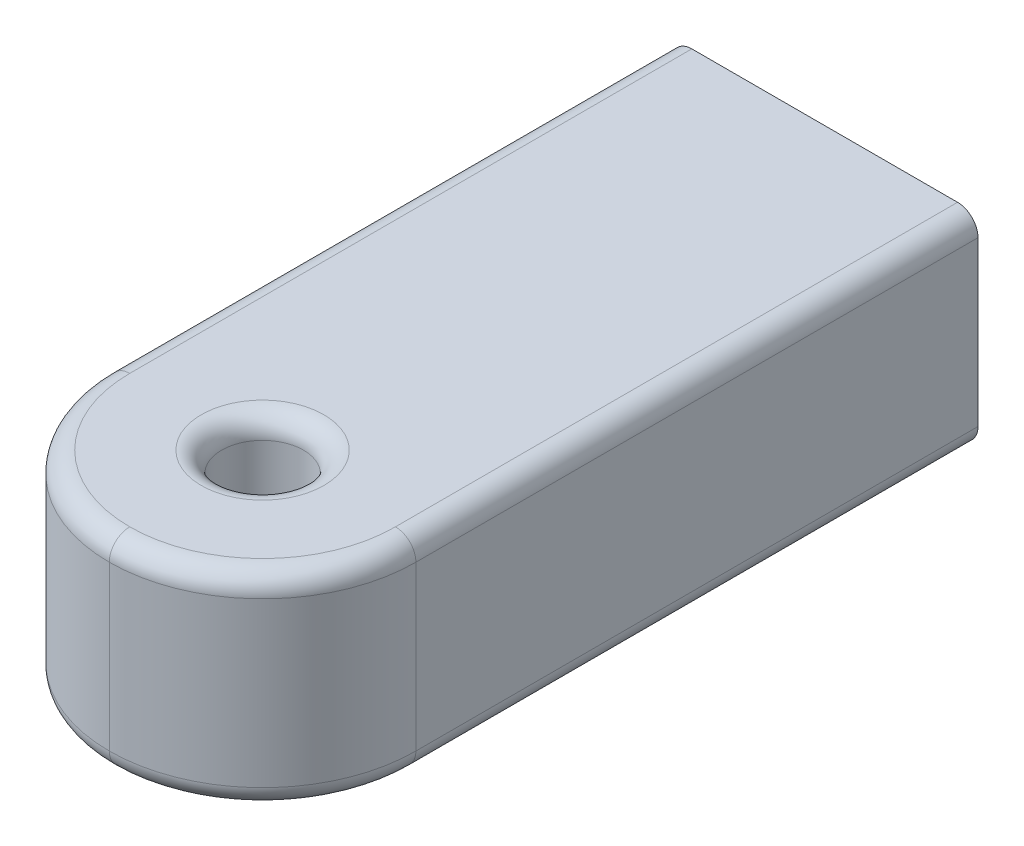
ISO-10303-21;
HEADER;
FILE_DESCRIPTION(('STEP AP214'),'2;1');
FILE_NAME('part.step','',(''),(''),'','','');
FILE_SCHEMA(('AUTOMOTIVE_DESIGN { 1 0 10303 214 1 1 1 1 }'));
ENDSEC;
DATA;
#1=APPLICATION_CONTEXT('core data for automotive mechanical design processes');
#2=APPLICATION_PROTOCOL_DEFINITION('international standard','automotive_design',2000,#1);
#3=PRODUCT_CONTEXT('',#1,'mechanical');
#4=PRODUCT('Part','Part','',(#3));
#5=PRODUCT_RELATED_PRODUCT_CATEGORY('part','',(#4));
#6=PRODUCT_DEFINITION_FORMATION('','',#4);
#7=PRODUCT_DEFINITION_CONTEXT('part definition',#1,'design');
#8=PRODUCT_DEFINITION('design','',#6,#7);
#9=PRODUCT_DEFINITION_SHAPE('','',#8);
#10=(LENGTH_UNIT() NAMED_UNIT(*) SI_UNIT(.MILLI.,.METRE.));
#11=(NAMED_UNIT(*) PLANE_ANGLE_UNIT() SI_UNIT($,.RADIAN.));
#12=(NAMED_UNIT(*) SI_UNIT($,.STERADIAN.) SOLID_ANGLE_UNIT());
#13=UNCERTAINTY_MEASURE_WITH_UNIT(LENGTH_MEASURE(1.E-05),#10,'distance_accuracy_value','');
#14=(GEOMETRIC_REPRESENTATION_CONTEXT(3) GLOBAL_UNCERTAINTY_ASSIGNED_CONTEXT((#13)) GLOBAL_UNIT_ASSIGNED_CONTEXT((#10,
#11,#12)) REPRESENTATION_CONTEXT('',''));
#15=CARTESIAN_POINT('',(0.,0.,0.));
#16=DIRECTION('',(0.,0.,1.));
#17=DIRECTION('',(1.,0.,0.));
#18=AXIS2_PLACEMENT_3D('',#15,#16,#17);
#19=CARTESIAN_POINT('',(7.5,5.,35.));
#20=DIRECTION('',(1.,0.,0.));
#21=DIRECTION('',(0.,1.,0.));
#22=AXIS2_PLACEMENT_3D('',#19,#20,#21);
#23=PLANE('',#22);
#24=DIRECTION('',(0.,-1.,0.));
#25=VECTOR('',#24,1.);
#26=CARTESIAN_POINT('',(7.5,-5.,27.5));
#27=LINE('',#26,#25);
#28=CARTESIAN_POINT('',(7.5,4.,27.5));
#29=VERTEX_POINT('',#28);
#30=CARTESIAN_POINT('',(7.5,-4.,27.5));
#31=VERTEX_POINT('',#30);
#32=EDGE_CURVE('E121',#29,#31,#27,.T.);
#33=ORIENTED_EDGE('',*,*,#32,.T.);
#34=DIRECTION('',(0.,0.,-1.));
#35=VECTOR('',#34,1.);
#36=CARTESIAN_POINT('',(7.5,-4.,35.));
#37=LINE('',#36,#35);
#38=CARTESIAN_POINT('',(7.5,-4.,0.));
#39=VERTEX_POINT('',#38);
#40=EDGE_CURVE('E129',#31,#39,#37,.T.);
#41=ORIENTED_EDGE('',*,*,#40,.T.);
#42=DIRECTION('',(0.,-1.,0.));
#43=VECTOR('',#42,1.);
#44=CARTESIAN_POINT('',(7.5,5.,0.));
#45=LINE('',#44,#43);
#46=CARTESIAN_POINT('',(7.5,4.,0.));
#47=VERTEX_POINT('',#46);
#48=EDGE_CURVE('E124',#47,#39,#45,.T.);
#49=ORIENTED_EDGE('',*,*,#48,.F.);
#50=DIRECTION('',(0.,0.,-1.));
#51=VECTOR('',#50,1.);
#52=CARTESIAN_POINT('',(7.5,4.,27.5));
#53=LINE('',#52,#51);
#54=EDGE_CURVE('E118',#47,#29,#53,.F.);
#55=ORIENTED_EDGE('',*,*,#54,.T.);
#56=EDGE_LOOP('',(#33,#41,#49,#55));
#57=FACE_BOUND('',#56,.T.);
#58=ADVANCED_FACE('F40',(#57),#23,.T.);
#59=CARTESIAN_POINT('',(7.5,5.,35.));
#60=DIRECTION('',(0.,-1.,0.));
#61=DIRECTION('',(1.,0.,0.));
#62=AXIS2_PLACEMENT_3D('',#59,#60,#61);
#63=PLANE('',#62);
#64=CARTESIAN_POINT('',(0.,5.,27.5));
#65=DIRECTION('',(0.,-1.,0.));
#66=DIRECTION('',(1.,0.,0.));
#67=AXIS2_PLACEMENT_3D('',#64,#65,#66);
#68=CIRCLE('',#67,3.);
#69=CARTESIAN_POINT('',(3.,5.,27.5));
#70=VERTEX_POINT('',#69);
#71=EDGE_CURVE('E182',#70,#70,#68,.T.);
#72=ORIENTED_EDGE('',*,*,#71,.T.);
#73=EDGE_LOOP('',(#72));
#74=FACE_BOUND('',#73,.T.);
#75=DIRECTION('',(-1.,0.,0.));
#76=VECTOR('',#75,1.);
#77=CARTESIAN_POINT('',(7.5,5.,0.));
#78=LINE('',#77,#76);
#79=CARTESIAN_POINT('',(6.5,5.,0.));
#80=VERTEX_POINT('',#79);
#81=CARTESIAN_POINT('',(-6.5,5.,0.));
#82=VERTEX_POINT('',#81);
#83=EDGE_CURVE('E141',#80,#82,#78,.T.);
#84=ORIENTED_EDGE('',*,*,#83,.T.);
#85=DIRECTION('',(0.,0.,-1.));
#86=VECTOR('',#85,1.);
#87=CARTESIAN_POINT('',(-6.5,5.,35.));
#88=LINE('',#87,#86);
#89=CARTESIAN_POINT('',(-6.5,5.,27.5));
#90=VERTEX_POINT('',#89);
#91=EDGE_CURVE('E179',#82,#90,#88,.F.);
#92=ORIENTED_EDGE('',*,*,#91,.T.);
#93=CARTESIAN_POINT('',(0.,5.,27.5));
#94=DIRECTION('',(0.,-1.,0.));
#95=DIRECTION('',(1.,0.,0.));
#96=AXIS2_PLACEMENT_3D('',#93,#94,#95);
#97=CIRCLE('',#96,6.5);
#98=CARTESIAN_POINT('',(0.,5.,34.));
#99=VERTEX_POINT('',#98);
#100=EDGE_CURVE('E63',#90,#99,#97,.F.);
#101=ORIENTED_EDGE('',*,*,#100,.T.);
#102=CARTESIAN_POINT('',(0.,5.,27.5));
#103=DIRECTION('',(0.,-1.,0.));
#104=DIRECTION('',(1.,0.,0.));
#105=AXIS2_PLACEMENT_3D('',#102,#103,#104);
#106=CIRCLE('',#105,6.5);
#107=CARTESIAN_POINT('',(6.5,5.,27.5));
#108=VERTEX_POINT('',#107);
#109=EDGE_CURVE('E58',#99,#108,#106,.F.);
#110=ORIENTED_EDGE('',*,*,#109,.T.);
#111=DIRECTION('',(0.,0.,-1.));
#112=VECTOR('',#111,1.);
#113=CARTESIAN_POINT('',(6.5,5.,0.));
#114=LINE('',#113,#112);
#115=EDGE_CURVE('E145',#108,#80,#114,.T.);
#116=ORIENTED_EDGE('',*,*,#115,.T.);
#117=EDGE_LOOP('',(#84,#92,#101,#110,#116));
#118=FACE_BOUND('',#117,.T.);
#119=ADVANCED_FACE('F281',(#74,#118),#63,.F.);
#120=CARTESIAN_POINT('',(-7.5,5.,35.));
#121=DIRECTION('',(1.,0.,0.));
#122=DIRECTION('',(0.,1.,0.));
#123=AXIS2_PLACEMENT_3D('',#120,#121,#122);
#124=PLANE('',#123);
#125=DIRECTION('',(0.,-1.,0.));
#126=VECTOR('',#125,1.);
#127=CARTESIAN_POINT('',(-7.5,5.,0.));
#128=LINE('',#127,#126);
#129=CARTESIAN_POINT('',(-7.5,4.,0.));
#130=VERTEX_POINT('',#129);
#131=CARTESIAN_POINT('',(-7.5,-4.,0.));
#132=VERTEX_POINT('',#131);
#133=EDGE_CURVE('E275',#130,#132,#128,.T.);
#134=ORIENTED_EDGE('',*,*,#133,.T.);
#135=DIRECTION('',(0.,0.,-1.));
#136=VECTOR('',#135,1.);
#137=CARTESIAN_POINT('',(-7.5,-4.,27.5));
#138=LINE('',#137,#136);
#139=CARTESIAN_POINT('',(-7.5,-4.,27.5));
#140=VERTEX_POINT('',#139);
#141=EDGE_CURVE('E171',#132,#140,#138,.F.);
#142=ORIENTED_EDGE('',*,*,#141,.T.);
#143=DIRECTION('',(0.,-1.,0.));
#144=VECTOR('',#143,1.);
#145=CARTESIAN_POINT('',(-7.5,5.,27.5));
#146=LINE('',#145,#144);
#147=CARTESIAN_POINT('',(-7.5,4.,27.5));
#148=VERTEX_POINT('',#147);
#149=EDGE_CURVE('E130',#140,#148,#146,.F.);
#150=ORIENTED_EDGE('',*,*,#149,.T.);
#151=DIRECTION('',(0.,0.,-1.));
#152=VECTOR('',#151,1.);
#153=CARTESIAN_POINT('',(-7.5,4.,35.));
#154=LINE('',#153,#152);
#155=EDGE_CURVE('E160',#148,#130,#154,.T.);
#156=ORIENTED_EDGE('',*,*,#155,.T.);
#157=EDGE_LOOP('',(#134,#142,#150,#156));
#158=FACE_BOUND('',#157,.T.);
#159=ADVANCED_FACE('F223',(#158),#124,.F.);
#160=CARTESIAN_POINT('',(7.5,-5.,35.));
#161=DIRECTION('',(0.,-1.,0.));
#162=DIRECTION('',(1.,0.,0.));
#163=AXIS2_PLACEMENT_3D('',#160,#161,#162);
#164=PLANE('',#163);
#165=CARTESIAN_POINT('',(0.,-5.,27.5));
#166=DIRECTION('',(0.,-1.,0.));
#167=DIRECTION('',(1.,0.,0.));
#168=AXIS2_PLACEMENT_3D('',#165,#166,#167);
#169=CIRCLE('',#168,3.);
#170=CARTESIAN_POINT('',(3.,-5.,27.5));
#171=VERTEX_POINT('',#170);
#172=EDGE_CURVE('E155',#171,#171,#169,.F.);
#173=ORIENTED_EDGE('',*,*,#172,.T.);
#174=EDGE_LOOP('',(#173));
#175=FACE_BOUND('',#174,.T.);
#176=DIRECTION('',(-1.,0.,0.));
#177=VECTOR('',#176,1.);
#178=CARTESIAN_POINT('',(7.5,-5.,0.));
#179=LINE('',#178,#177);
#180=CARTESIAN_POINT('',(6.5,-5.,0.));
#181=VERTEX_POINT('',#180);
#182=CARTESIAN_POINT('',(-6.5,-5.,0.));
#183=VERTEX_POINT('',#182);
#184=EDGE_CURVE('E263',#181,#183,#179,.T.);
#185=ORIENTED_EDGE('',*,*,#184,.F.);
#186=DIRECTION('',(0.,0.,-1.));
#187=VECTOR('',#186,1.);
#188=CARTESIAN_POINT('',(6.5,-5.,35.));
#189=LINE('',#188,#187);
#190=CARTESIAN_POINT('',(6.5,-5.,27.5));
#191=VERTEX_POINT('',#190);
#192=EDGE_CURVE('E164',#181,#191,#189,.F.);
#193=ORIENTED_EDGE('',*,*,#192,.T.);
#194=CARTESIAN_POINT('',(0.,-5.,27.5));
#195=DIRECTION('',(0.,-1.,0.));
#196=DIRECTION('',(1.,0.,0.));
#197=AXIS2_PLACEMENT_3D('',#194,#195,#196);
#198=CIRCLE('',#197,6.5);
#199=CARTESIAN_POINT('',(0.,-5.,34.));
#200=VERTEX_POINT('',#199);
#201=EDGE_CURVE('E252',#191,#200,#198,.T.);
#202=ORIENTED_EDGE('',*,*,#201,.T.);
#203=CARTESIAN_POINT('',(0.,-5.,27.5));
#204=DIRECTION('',(0.,-1.,0.));
#205=DIRECTION('',(1.,0.,0.));
#206=AXIS2_PLACEMENT_3D('',#203,#204,#205);
#207=CIRCLE('',#206,6.5);
#208=CARTESIAN_POINT('',(-6.5,-5.,27.5));
#209=VERTEX_POINT('',#208);
#210=EDGE_CURVE('E246',#200,#209,#207,.T.);
#211=ORIENTED_EDGE('',*,*,#210,.T.);
#212=DIRECTION('',(0.,0.,-1.));
#213=VECTOR('',#212,1.);
#214=CARTESIAN_POINT('',(-6.5,-5.,0.));
#215=LINE('',#214,#213);
#216=EDGE_CURVE('E249',#209,#183,#215,.T.);
#217=ORIENTED_EDGE('',*,*,#216,.T.);
#218=EDGE_LOOP('',(#185,#193,#202,#211,#217));
#219=FACE_BOUND('',#218,.T.);
#220=ADVANCED_FACE('F260',(#175,#219),#164,.T.);
#221=CARTESIAN_POINT('',(0.,0.,0.));
#222=DIRECTION('',(0.,0.,-1.));
#223=DIRECTION('',(-1.,0.,0.));
#224=AXIS2_PLACEMENT_3D('',#221,#222,#223);
#225=PLANE('',#224);
#226=ORIENTED_EDGE('',*,*,#48,.T.);
#227=CARTESIAN_POINT('',(6.5,-4.,0.));
#228=DIRECTION('',(0.,0.,-1.));
#229=DIRECTION('',(-1.,0.,0.));
#230=AXIS2_PLACEMENT_3D('',#227,#228,#229);
#231=CIRCLE('',#230,1.);
#232=EDGE_CURVE('E243',#39,#181,#231,.T.);
#233=ORIENTED_EDGE('',*,*,#232,.T.);
#234=ORIENTED_EDGE('',*,*,#184,.T.);
#235=CARTESIAN_POINT('',(-6.5,-4.,0.));
#236=DIRECTION('',(0.,0.,-1.));
#237=DIRECTION('',(-1.,0.,0.));
#238=AXIS2_PLACEMENT_3D('',#235,#236,#237);
#239=CIRCLE('',#238,1.);
#240=EDGE_CURVE('E241',#183,#132,#239,.T.);
#241=ORIENTED_EDGE('',*,*,#240,.T.);
#242=ORIENTED_EDGE('',*,*,#133,.F.);
#243=CARTESIAN_POINT('',(-6.5,4.,0.));
#244=DIRECTION('',(0.,0.,-1.));
#245=DIRECTION('',(-1.,0.,0.));
#246=AXIS2_PLACEMENT_3D('',#243,#244,#245);
#247=CIRCLE('',#246,1.);
#248=EDGE_CURVE('E238',#130,#82,#247,.T.);
#249=ORIENTED_EDGE('',*,*,#248,.T.);
#250=ORIENTED_EDGE('',*,*,#83,.F.);
#251=CARTESIAN_POINT('',(6.5,4.,0.));
#252=DIRECTION('',(0.,0.,-1.));
#253=DIRECTION('',(-1.,0.,0.));
#254=AXIS2_PLACEMENT_3D('',#251,#252,#253);
#255=CIRCLE('',#254,1.);
#256=EDGE_CURVE('E235',#80,#47,#255,.T.);
#257=ORIENTED_EDGE('',*,*,#256,.T.);
#258=EDGE_LOOP('',(#226,#233,#234,#241,#242,#249,#250,#257));
#259=FACE_BOUND('',#258,.T.);
#260=ADVANCED_FACE('F271',(#259),#225,.T.);
#261=CARTESIAN_POINT('',(0.,0.,27.5));
#262=DIRECTION('',(0.,-1.,0.));
#263=DIRECTION('',(1.,0.,0.));
#264=AXIS2_PLACEMENT_3D('',#261,#262,#263);
#265=CYLINDRICAL_SURFACE('',#264,7.5);
#266=ORIENTED_EDGE('',*,*,#149,.F.);
#267=CARTESIAN_POINT('',(0.,-4.,27.5));
#268=DIRECTION('',(0.,-1.,0.));
#269=DIRECTION('',(1.,0.,0.));
#270=AXIS2_PLACEMENT_3D('',#267,#268,#269);
#271=CIRCLE('',#270,7.5);
#272=CARTESIAN_POINT('',(0.,-4.,35.));
#273=VERTEX_POINT('',#272);
#274=EDGE_CURVE('E11',#140,#273,#271,.F.);
#275=ORIENTED_EDGE('',*,*,#274,.T.);
#276=DIRECTION('',(0.,-1.,0.));
#277=VECTOR('',#276,1.);
#278=CARTESIAN_POINT('',(0.,0.,35.));
#279=LINE('',#278,#277);
#280=CARTESIAN_POINT('',(0.,4.,35.));
#281=VERTEX_POINT('',#280);
#282=EDGE_CURVE('E207',#281,#273,#279,.T.);
#283=ORIENTED_EDGE('',*,*,#282,.F.);
#284=CARTESIAN_POINT('',(0.,4.,27.5));
#285=DIRECTION('',(0.,-1.,0.));
#286=DIRECTION('',(1.,0.,0.));
#287=AXIS2_PLACEMENT_3D('',#284,#285,#286);
#288=CIRCLE('',#287,7.5);
#289=EDGE_CURVE('E50',#281,#148,#288,.T.);
#290=ORIENTED_EDGE('',*,*,#289,.T.);
#291=EDGE_LOOP('',(#266,#275,#283,#290));
#292=FACE_BOUND('',#291,.T.);
#293=ADVANCED_FACE('F219',(#292),#265,.T.);
#294=CARTESIAN_POINT('',(0.,5.,27.5));
#295=DIRECTION('',(0.,1.,0.));
#296=DIRECTION('',(-1.,0.,0.));
#297=AXIS2_PLACEMENT_3D('',#294,#295,#296);
#298=CYLINDRICAL_SURFACE('',#297,7.5);
#299=ORIENTED_EDGE('',*,*,#282,.T.);
#300=CARTESIAN_POINT('',(0.,-4.,27.5));
#301=DIRECTION('',(0.,-1.,0.));
#302=DIRECTION('',(1.,0.,0.));
#303=AXIS2_PLACEMENT_3D('',#300,#301,#302);
#304=CIRCLE('',#303,7.5);
#305=EDGE_CURVE('E139',#273,#31,#304,.F.);
#306=ORIENTED_EDGE('',*,*,#305,.T.);
#307=ORIENTED_EDGE('',*,*,#32,.F.);
#308=CARTESIAN_POINT('',(0.,4.,27.5));
#309=DIRECTION('',(0.,-1.,0.));
#310=DIRECTION('',(1.,0.,0.));
#311=AXIS2_PLACEMENT_3D('',#308,#309,#310);
#312=CIRCLE('',#311,7.5);
#313=EDGE_CURVE('E136',#29,#281,#312,.T.);
#314=ORIENTED_EDGE('',*,*,#313,.T.);
#315=EDGE_LOOP('',(#299,#306,#307,#314));
#316=FACE_BOUND('',#315,.T.);
#317=ADVANCED_FACE('F134',(#316),#298,.T.);
#318=CARTESIAN_POINT('',(0.,-5.,27.5));
#319=DIRECTION('',(0.,1.,0.));
#320=DIRECTION('',(-1.,0.,0.));
#321=AXIS2_PLACEMENT_3D('',#318,#319,#320);
#322=CYLINDRICAL_SURFACE('',#321,2.);
#323=CARTESIAN_POINT('',(0.,-4.,27.5));
#324=DIRECTION('',(0.,-1.,0.));
#325=DIRECTION('',(1.,0.,0.));
#326=AXIS2_PLACEMENT_3D('',#323,#324,#325);
#327=CIRCLE('',#326,2.);
#328=CARTESIAN_POINT('',(-2.,-4.,27.5));
#329=VERTEX_POINT('',#328);
#330=EDGE_CURVE('E190',#329,#329,#327,.T.);
#331=CARTESIAN_POINT('',(0.,4.,27.5));
#332=DIRECTION('',(0.,-1.,0.));
#333=DIRECTION('',(1.,0.,0.));
#334=AXIS2_PLACEMENT_3D('',#331,#332,#333);
#335=CIRCLE('',#334,2.);
#336=CARTESIAN_POINT('',(-2.,4.,27.5));
#337=VERTEX_POINT('',#336);
#338=EDGE_CURVE('E186',#337,#337,#335,.F.);
#339=CARTESIAN_POINT('',(-2.,-4.,27.5));
#340=CARTESIAN_POINT('',(-2.,-3.91666666666667,27.5));
#341=CARTESIAN_POINT('',(-2.,-3.83333333333333,27.5));
#342=CARTESIAN_POINT('',(-2.,-3.66666666666667,27.5));
#343=CARTESIAN_POINT('',(-2.,-3.58333333333333,27.5));
#344=CARTESIAN_POINT('',(-2.,-3.41666666666667,27.5));
#345=CARTESIAN_POINT('',(-2.,-3.33333333333333,27.5));
#346=CARTESIAN_POINT('',(-2.,-3.16666666666667,27.5));
#347=CARTESIAN_POINT('',(-2.,-3.08333333333333,27.5));
#348=CARTESIAN_POINT('',(-2.,-2.91666666666667,27.5));
#349=CARTESIAN_POINT('',(-2.,-2.83333333333333,27.5));
#350=CARTESIAN_POINT('',(-2.,-2.66666666666667,27.5));
#351=CARTESIAN_POINT('',(-2.,-2.58333333333333,27.5));
#352=CARTESIAN_POINT('',(-2.,-2.41666666666667,27.5));
#353=CARTESIAN_POINT('',(-2.,-2.33333333333333,27.5));
#354=CARTESIAN_POINT('',(-2.,-2.16666666666667,27.5));
#355=CARTESIAN_POINT('',(-2.,-2.08333333333333,27.5));
#356=CARTESIAN_POINT('',(-2.,-1.91666666666667,27.5));
#357=CARTESIAN_POINT('',(-2.,-1.83333333333333,27.5));
#358=CARTESIAN_POINT('',(-2.,-1.66666666666667,27.5));
#359=CARTESIAN_POINT('',(-2.,-1.58333333333333,27.5));
#360=CARTESIAN_POINT('',(-2.,-1.41666666666667,27.5));
#361=CARTESIAN_POINT('',(-2.,-1.33333333333333,27.5));
#362=CARTESIAN_POINT('',(-2.,-1.16666666666667,27.5));
#363=CARTESIAN_POINT('',(-2.,-1.08333333333334,27.5));
#364=CARTESIAN_POINT('',(-2.,-0.916666666666668,27.5));
#365=CARTESIAN_POINT('',(-2.,-0.833333333333335,27.5));
#366=CARTESIAN_POINT('',(-2.,-0.666666666666668,27.5));
#367=CARTESIAN_POINT('',(-2.,-0.583333333333335,27.5));
#368=CARTESIAN_POINT('',(-2.,-0.416666666666668,27.5));
#369=CARTESIAN_POINT('',(-2.,-0.333333333333335,27.5));
#370=CARTESIAN_POINT('',(-2.,-0.166666666666669,27.5));
#371=CARTESIAN_POINT('',(-2.,-0.0833333333333351,27.5));
#372=CARTESIAN_POINT('',(-2.,0.0833333333333317,27.5));
#373=CARTESIAN_POINT('',(-2.,0.166666666666665,27.5));
#374=CARTESIAN_POINT('',(-2.,0.333333333333332,27.5));
#375=CARTESIAN_POINT('',(-2.,0.416666666666665,27.5));
#376=CARTESIAN_POINT('',(-2.,0.583333333333332,27.5));
#377=CARTESIAN_POINT('',(-2.,0.666666666666665,27.5));
#378=CARTESIAN_POINT('',(-2.,0.833333333333331,27.5));
#379=CARTESIAN_POINT('',(-2.,0.916666666666665,27.5));
#380=CARTESIAN_POINT('',(-2.,1.08333333333333,27.5));
#381=CARTESIAN_POINT('',(-2.,1.16666666666666,27.5));
#382=CARTESIAN_POINT('',(-2.,1.33333333333333,27.5));
#383=CARTESIAN_POINT('',(-2.,1.41666666666666,27.5));
#384=CARTESIAN_POINT('',(-2.,1.58333333333333,27.5));
#385=CARTESIAN_POINT('',(-2.,1.66666666666666,27.5));
#386=CARTESIAN_POINT('',(-2.,1.83333333333333,27.5));
#387=CARTESIAN_POINT('',(-2.,1.91666666666666,27.5));
#388=CARTESIAN_POINT('',(-2.,2.08333333333333,27.5));
#389=CARTESIAN_POINT('',(-2.,2.16666666666667,27.5));
#390=CARTESIAN_POINT('',(-2.,2.33333333333333,27.5));
#391=CARTESIAN_POINT('',(-2.,2.41666666666667,27.5));
#392=CARTESIAN_POINT('',(-2.,2.58333333333333,27.5));
#393=CARTESIAN_POINT('',(-2.,2.66666666666666,27.5));
#394=CARTESIAN_POINT('',(-2.,2.83333333333333,27.5));
#395=CARTESIAN_POINT('',(-2.,2.91666666666666,27.5));
#396=CARTESIAN_POINT('',(-2.,3.08333333333333,27.5));
#397=CARTESIAN_POINT('',(-2.,3.16666666666666,27.5));
#398=CARTESIAN_POINT('',(-2.,3.33333333333333,27.5));
#399=CARTESIAN_POINT('',(-2.,3.41666666666666,27.5));
#400=CARTESIAN_POINT('',(-2.,3.58333333333333,27.5));
#401=CARTESIAN_POINT('',(-2.,3.66666666666666,27.5));
#402=CARTESIAN_POINT('',(-2.,3.83333333333333,27.5));
#403=CARTESIAN_POINT('',(-2.,3.91666666666666,27.5));
#404=CARTESIAN_POINT('',(-2.,4.,27.5));
#405=B_SPLINE_CURVE_WITH_KNOTS('',3,(#339,#340,#341,#342,#343,#344,#345,#346,#347,#348,#349,
#350,#351,#352,#353,#354,#355,#356,#357,#358,#359,#360,#361,#362,#363,#364,#365,#366,#367,#368,
#369,#370,#371,#372,#373,#374,#375,#376,#377,#378,#379,#380,#381,#382,#383,#384,#385,#386,#387,
#388,#389,#390,#391,#392,#393,#394,#395,#396,#397,#398,#399,#400,#401,#402,#403,#404),
.UNSPECIFIED.,.F.,.F.,(4,2,2,2,2,2,2,2,2,2,2,2,2,2,2,2,2,2,2,2,2,2,2,2,2,2,2,2,2,2,2,2,4),(0.,
0.25,0.5,0.75,1.,1.25,1.5,1.75,2.,2.25,2.5,2.75,3.,3.25,3.5,3.75,4.,4.25,4.5,4.75,5.,5.25,5.5,
5.75,6.,6.25,6.5,6.75,7.,7.25,7.5,7.75,8.),.UNSPECIFIED.);
#406=EDGE_CURVE('BSEAM298',#329,#337,#405,.T.);
#407=ORIENTED_EDGE('',*,*,#330,.T.);
#408=ORIENTED_EDGE('',*,*,#338,.T.);
#409=ORIENTED_EDGE('',*,*,#406,.T.);
#410=ORIENTED_EDGE('',*,*,#406,.F.);
#411=EDGE_LOOP('',(#407,#409,#408,#410));
#412=FACE_BOUND('',#411,.T.);
#413=ADVANCED_FACE('F298',(#412),#322,.F.);
#414=CARTESIAN_POINT('',(-6.5,-4.,35.));
#415=DIRECTION('',(0.,0.,1.));
#416=DIRECTION('',(1.,0.,0.));
#417=AXIS2_PLACEMENT_3D('',#414,#415,#416);
#418=CYLINDRICAL_SURFACE('',#417,1.);
#419=ORIENTED_EDGE('',*,*,#240,.F.);
#420=ORIENTED_EDGE('',*,*,#216,.F.);
#421=CARTESIAN_POINT('',(-6.5,-4.,27.5));
#422=DIRECTION('',(0.,0.,1.));
#423=DIRECTION('',(1.,0.,0.));
#424=AXIS2_PLACEMENT_3D('',#421,#422,#423);
#425=CIRCLE('',#424,1.);
#426=EDGE_CURVE('E203',#140,#209,#425,.T.);
#427=ORIENTED_EDGE('',*,*,#426,.F.);
#428=ORIENTED_EDGE('',*,*,#141,.F.);
#429=EDGE_LOOP('',(#419,#420,#427,#428));
#430=FACE_BOUND('',#429,.T.);
#431=ADVANCED_FACE('F286',(#430),#418,.T.);
#432=CARTESIAN_POINT('',(0.,-4.,27.5));
#433=DIRECTION('',(0.,-1.,0.));
#434=DIRECTION('',(1.,0.,0.));
#435=AXIS2_PLACEMENT_3D('',#432,#433,#434);
#436=TOROIDAL_SURFACE('',#435,6.5,1.);
#437=ORIENTED_EDGE('',*,*,#426,.T.);
#438=ORIENTED_EDGE('',*,*,#210,.F.);
#439=CARTESIAN_POINT('',(0.,-4.,34.));
#440=DIRECTION('',(1.,0.,0.));
#441=DIRECTION('',(0.,1.,0.));
#442=AXIS2_PLACEMENT_3D('',#439,#440,#441);
#443=CIRCLE('',#442,1.);
#444=EDGE_CURVE('E199',#273,#200,#443,.T.);
#445=ORIENTED_EDGE('',*,*,#444,.F.);
#446=ORIENTED_EDGE('',*,*,#274,.F.);
#447=EDGE_LOOP('',(#437,#438,#445,#446));
#448=FACE_BOUND('',#447,.T.);
#449=ADVANCED_FACE('F290',(#448),#436,.T.);
#450=CARTESIAN_POINT('',(0.,-4.,27.5));
#451=DIRECTION('',(0.,-1.,0.));
#452=DIRECTION('',(1.,0.,0.));
#453=AXIS2_PLACEMENT_3D('',#450,#451,#452);
#454=TOROIDAL_SURFACE('',#453,6.5,1.);
#455=ORIENTED_EDGE('',*,*,#444,.T.);
#456=ORIENTED_EDGE('',*,*,#201,.F.);
#457=CARTESIAN_POINT('',(6.5,-4.,27.5));
#458=DIRECTION('',(0.,0.,-1.));
#459=DIRECTION('',(-1.,0.,0.));
#460=AXIS2_PLACEMENT_3D('',#457,#458,#459);
#461=CIRCLE('',#460,1.);
#462=EDGE_CURVE('E148',#31,#191,#461,.T.);
#463=ORIENTED_EDGE('',*,*,#462,.F.);
#464=ORIENTED_EDGE('',*,*,#305,.F.);
#465=EDGE_LOOP('',(#455,#456,#463,#464));
#466=FACE_BOUND('',#465,.T.);
#467=ADVANCED_FACE('F266',(#466),#454,.T.);
#468=CARTESIAN_POINT('',(6.5,-4.,35.));
#469=DIRECTION('',(0.,0.,-1.));
#470=DIRECTION('',(-1.,0.,0.));
#471=AXIS2_PLACEMENT_3D('',#468,#469,#470);
#472=CYLINDRICAL_SURFACE('',#471,1.);
#473=ORIENTED_EDGE('',*,*,#462,.T.);
#474=ORIENTED_EDGE('',*,*,#192,.F.);
#475=ORIENTED_EDGE('',*,*,#232,.F.);
#476=ORIENTED_EDGE('',*,*,#40,.F.);
#477=EDGE_LOOP('',(#473,#474,#475,#476));
#478=FACE_BOUND('',#477,.T.);
#479=ADVANCED_FACE('F269',(#478),#472,.T.);
#480=CARTESIAN_POINT('',(6.5,4.,35.));
#481=DIRECTION('',(0.,0.,1.));
#482=DIRECTION('',(1.,0.,0.));
#483=AXIS2_PLACEMENT_3D('',#480,#481,#482);
#484=CYLINDRICAL_SURFACE('',#483,1.);
#485=ORIENTED_EDGE('',*,*,#256,.F.);
#486=ORIENTED_EDGE('',*,*,#115,.F.);
#487=CARTESIAN_POINT('',(6.5,4.,27.5));
#488=DIRECTION('',(0.,0.,1.));
#489=DIRECTION('',(1.,0.,0.));
#490=AXIS2_PLACEMENT_3D('',#487,#488,#489);
#491=CIRCLE('',#490,1.);
#492=EDGE_CURVE('E44',#29,#108,#491,.T.);
#493=ORIENTED_EDGE('',*,*,#492,.F.);
#494=ORIENTED_EDGE('',*,*,#54,.F.);
#495=EDGE_LOOP('',(#485,#486,#493,#494));
#496=FACE_BOUND('',#495,.T.);
#497=ADVANCED_FACE('F144',(#496),#484,.T.);
#498=CARTESIAN_POINT('',(0.,4.,27.5));
#499=DIRECTION('',(0.,-1.,0.));
#500=DIRECTION('',(1.,0.,0.));
#501=AXIS2_PLACEMENT_3D('',#498,#499,#500);
#502=TOROIDAL_SURFACE('',#501,6.5,1.);
#503=ORIENTED_EDGE('',*,*,#492,.T.);
#504=ORIENTED_EDGE('',*,*,#109,.F.);
#505=CARTESIAN_POINT('',(0.,4.,34.));
#506=DIRECTION('',(-1.,0.,0.));
#507=DIRECTION('',(0.,0.,1.));
#508=AXIS2_PLACEMENT_3D('',#505,#506,#507);
#509=CIRCLE('',#508,1.);
#510=EDGE_CURVE('E149',#281,#99,#509,.T.);
#511=ORIENTED_EDGE('',*,*,#510,.F.);
#512=ORIENTED_EDGE('',*,*,#313,.F.);
#513=EDGE_LOOP('',(#503,#504,#511,#512));
#514=FACE_BOUND('',#513,.T.);
#515=ADVANCED_FACE('F151',(#514),#502,.T.);
#516=CARTESIAN_POINT('',(0.,4.,27.5));
#517=DIRECTION('',(0.,-1.,0.));
#518=DIRECTION('',(1.,0.,0.));
#519=AXIS2_PLACEMENT_3D('',#516,#517,#518);
#520=TOROIDAL_SURFACE('',#519,6.5,1.);
#521=ORIENTED_EDGE('',*,*,#510,.T.);
#522=ORIENTED_EDGE('',*,*,#100,.F.);
#523=CARTESIAN_POINT('',(-6.5,4.,27.5));
#524=DIRECTION('',(0.,0.,-1.));
#525=DIRECTION('',(-1.,0.,0.));
#526=AXIS2_PLACEMENT_3D('',#523,#524,#525);
#527=CIRCLE('',#526,1.);
#528=EDGE_CURVE('E208',#148,#90,#527,.T.);
#529=ORIENTED_EDGE('',*,*,#528,.F.);
#530=ORIENTED_EDGE('',*,*,#289,.F.);
#531=EDGE_LOOP('',(#521,#522,#529,#530));
#532=FACE_BOUND('',#531,.T.);
#533=ADVANCED_FACE('F213',(#532),#520,.T.);
#534=CARTESIAN_POINT('',(-6.5,4.,35.));
#535=DIRECTION('',(0.,0.,-1.));
#536=DIRECTION('',(-1.,0.,0.));
#537=AXIS2_PLACEMENT_3D('',#534,#535,#536);
#538=CYLINDRICAL_SURFACE('',#537,1.);
#539=ORIENTED_EDGE('',*,*,#528,.T.);
#540=ORIENTED_EDGE('',*,*,#91,.F.);
#541=ORIENTED_EDGE('',*,*,#248,.F.);
#542=ORIENTED_EDGE('',*,*,#155,.F.);
#543=EDGE_LOOP('',(#539,#540,#541,#542));
#544=FACE_BOUND('',#543,.T.);
#545=ADVANCED_FACE('F283',(#544),#538,.T.);
#546=CARTESIAN_POINT('',(0.,-4.,27.5));
#547=DIRECTION('',(0.,-1.,0.));
#548=DIRECTION('',(1.,0.,0.));
#549=AXIS2_PLACEMENT_3D('',#546,#547,#548);
#550=TOROIDAL_SURFACE('',#549,3.,1.);
#551=ORIENTED_EDGE('',*,*,#330,.F.);
#552=EDGE_LOOP('',(#551));
#553=FACE_BOUND('',#552,.T.);
#554=ORIENTED_EDGE('',*,*,#172,.F.);
#555=EDGE_LOOP('',(#554));
#556=FACE_BOUND('',#555,.T.);
#557=ADVANCED_FACE('F324',(#553,#556),#550,.T.);
#558=CARTESIAN_POINT('',(0.,4.,27.5));
#559=DIRECTION('',(0.,-1.,0.));
#560=DIRECTION('',(1.,0.,0.));
#561=AXIS2_PLACEMENT_3D('',#558,#559,#560);
#562=TOROIDAL_SURFACE('',#561,3.,1.);
#563=ORIENTED_EDGE('',*,*,#338,.F.);
#564=EDGE_LOOP('',(#563));
#565=FACE_BOUND('',#564,.T.);
#566=ORIENTED_EDGE('',*,*,#71,.F.);
#567=EDGE_LOOP('',(#566));
#568=FACE_BOUND('',#567,.T.);
#569=ADVANCED_FACE('F42',(#565,#568),#562,.T.);
#570=CLOSED_SHELL('',(#58,#119,#159,#220,#260,#293,#317,#413,#431,#449,#467,#479,#497,#515,#533,
#545,#557,#569));
#571=MANIFOLD_SOLID_BREP('B2',#570);
#572=ADVANCED_BREP_SHAPE_REPRESENTATION('',(#18,#571),#14);
#573=SHAPE_DEFINITION_REPRESENTATION(#9,#572);
ENDSEC;
END-ISO-10303-21;
